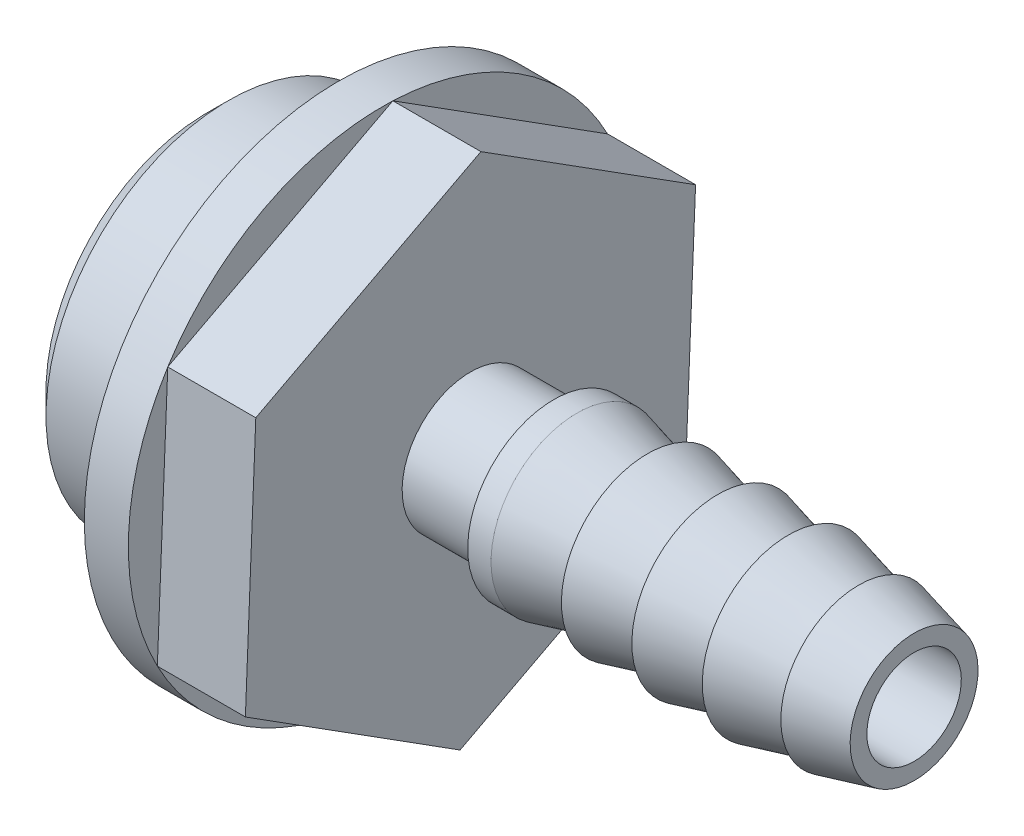
ISO-10303-21;
HEADER;
FILE_DESCRIPTION(('STEP AP214'),'2;1');
FILE_NAME('part.step','',(''),(''),'','','');
FILE_SCHEMA(('AUTOMOTIVE_DESIGN { 1 0 10303 214 1 1 1 1 }'));
ENDSEC;
DATA;
#1=APPLICATION_CONTEXT('core data for automotive mechanical design processes');
#2=APPLICATION_PROTOCOL_DEFINITION('international standard','automotive_design',2000,#1);
#3=PRODUCT_CONTEXT('',#1,'mechanical');
#4=PRODUCT('Part','Part','',(#3));
#5=PRODUCT_RELATED_PRODUCT_CATEGORY('part','',(#4));
#6=PRODUCT_DEFINITION_FORMATION('','',#4);
#7=PRODUCT_DEFINITION_CONTEXT('part definition',#1,'design');
#8=PRODUCT_DEFINITION('design','',#6,#7);
#9=PRODUCT_DEFINITION_SHAPE('','',#8);
#10=(LENGTH_UNIT() NAMED_UNIT(*) SI_UNIT(.MILLI.,.METRE.));
#11=(NAMED_UNIT(*) PLANE_ANGLE_UNIT() SI_UNIT($,.RADIAN.));
#12=(NAMED_UNIT(*) SI_UNIT($,.STERADIAN.) SOLID_ANGLE_UNIT());
#13=UNCERTAINTY_MEASURE_WITH_UNIT(LENGTH_MEASURE(1.E-05),#10,'distance_accuracy_value','');
#14=(GEOMETRIC_REPRESENTATION_CONTEXT(3) GLOBAL_UNCERTAINTY_ASSIGNED_CONTEXT((#13)) GLOBAL_UNIT_ASSIGNED_CONTEXT((#10,
#11,#12)) REPRESENTATION_CONTEXT('',''));
#15=CARTESIAN_POINT('',(0.,0.,0.));
#16=DIRECTION('',(0.,0.,1.));
#17=DIRECTION('',(1.,0.,0.));
#18=AXIS2_PLACEMENT_3D('',#15,#16,#17);
#19=CARTESIAN_POINT('',(-4.7625,0.,0.));
#20=DIRECTION('',(-1.,0.,0.));
#21=DIRECTION('',(0.,0.,1.));
#22=AXIS2_PLACEMENT_3D('',#19,#20,#21);
#23=PLANE('',#22);
#24=CARTESIAN_POINT('',(-4.7625,0.,0.));
#25=DIRECTION('',(-1.,0.,0.));
#26=DIRECTION('',(0.,0.,1.));
#27=AXIS2_PLACEMENT_3D('',#24,#25,#26);
#28=CIRCLE('',#27,9.16543552338531);
#29=CARTESIAN_POINT('',(-4.7625,0.,9.16543552338531));
#30=VERTEX_POINT('',#29);
#31=EDGE_CURVE('E149',#30,#30,#28,.T.);
#32=ORIENTED_EDGE('',*,*,#31,.T.);
#33=EDGE_LOOP('',(#32));
#34=FACE_BOUND('',#33,.T.);
#35=CARTESIAN_POINT('',(-4.7625,0.,0.));
#36=DIRECTION('',(-1.,0.,0.));
#37=DIRECTION('',(0.,0.,1.));
#38=AXIS2_PLACEMENT_3D('',#35,#36,#37);
#39=CIRCLE('',#38,6.5786);
#40=CARTESIAN_POINT('',(-4.7625,0.,-6.5786));
#41=VERTEX_POINT('',#40);
#42=EDGE_CURVE('E155',#41,#41,#39,.T.);
#43=ORIENTED_EDGE('',*,*,#42,.F.);
#44=EDGE_LOOP('',(#43));
#45=FACE_BOUND('',#44,.T.);
#46=ADVANCED_FACE('F48',(#34,#45),#23,.T.);
#47=CARTESIAN_POINT('',(0.,0.,0.));
#48=DIRECTION('',(-1.,0.,0.));
#49=DIRECTION('',(0.,-1.,0.));
#50=AXIS2_PLACEMENT_3D('',#47,#48,#49);
#51=CYLINDRICAL_SURFACE('',#50,1.70299999999999);
#52=CARTESIAN_POINT('',(-1.00000000000001,0.,0.));
#53=DIRECTION('',(1.,0.,0.));
#54=DIRECTION('',(0.,1.,0.));
#55=AXIS2_PLACEMENT_3D('',#52,#53,#54);
#56=CIRCLE('',#55,1.70299999999999);
#57=CARTESIAN_POINT('',(-1.00000000000001,1.70299999999999,0.));
#58=VERTEX_POINT('',#57);
#59=EDGE_CURVE('E57',#58,#58,#56,.F.);
#60=ORIENTED_EDGE('',*,*,#59,.T.);
#61=EDGE_LOOP('',(#60));
#62=FACE_BOUND('',#61,.T.);
#63=CARTESIAN_POINT('',(16.,0.,0.));
#64=DIRECTION('',(-1.,0.,0.));
#65=DIRECTION('',(0.,-1.,0.));
#66=AXIS2_PLACEMENT_3D('',#63,#64,#65);
#67=CIRCLE('',#66,1.70299999999999);
#68=CARTESIAN_POINT('',(16.,-1.70299999999999,0.));
#69=VERTEX_POINT('',#68);
#70=EDGE_CURVE('E583',#69,#69,#67,.T.);
#71=ORIENTED_EDGE('',*,*,#70,.F.);
#72=EDGE_LOOP('',(#71));
#73=FACE_BOUND('',#72,.T.);
#74=ADVANCED_FACE('F193',(#62,#73),#51,.F.);
#75=CARTESIAN_POINT('',(16.,1.703,0.));
#76=DIRECTION('',(-1.,0.,0.));
#77=DIRECTION('',(0.,-1.,0.));
#78=AXIS2_PLACEMENT_3D('',#75,#76,#77);
#79=PLANE('',#78);
#80=CARTESIAN_POINT('',(16.,0.,0.));
#81=DIRECTION('',(-1.,0.,0.));
#82=DIRECTION('',(0.,-1.,0.));
#83=AXIS2_PLACEMENT_3D('',#80,#81,#82);
#84=CIRCLE('',#83,2.30625);
#85=CARTESIAN_POINT('',(16.,-2.30624999999999,0.));
#86=VERTEX_POINT('',#85);
#87=EDGE_CURVE('E182',#86,#86,#84,.F.);
#88=ORIENTED_EDGE('',*,*,#87,.T.);
#89=EDGE_LOOP('',(#88));
#90=FACE_BOUND('',#89,.T.);
#91=ORIENTED_EDGE('',*,*,#70,.T.);
#92=EDGE_LOOP('',(#91));
#93=FACE_BOUND('',#92,.T.);
#94=ADVANCED_FACE('F211',(#90,#93),#79,.F.);
#95=CARTESIAN_POINT('',(14.,3.1,0.));
#96=DIRECTION('',(1.,0.,0.));
#97=DIRECTION('',(0.,1.,0.));
#98=AXIS2_PLACEMENT_3D('',#95,#96,#97);
#99=PLANE('',#98);
#100=CARTESIAN_POINT('',(14.,0.,0.));
#101=DIRECTION('',(1.,0.,0.));
#102=DIRECTION('',(0.,1.,0.));
#103=AXIS2_PLACEMENT_3D('',#100,#101,#102);
#104=CIRCLE('',#103,2.80625);
#105=CARTESIAN_POINT('',(14.,2.80625,0.));
#106=VERTEX_POINT('',#105);
#107=EDGE_CURVE('E187',#106,#106,#104,.F.);
#108=ORIENTED_EDGE('',*,*,#107,.T.);
#109=EDGE_LOOP('',(#108));
#110=FACE_BOUND('',#109,.T.);
#111=CARTESIAN_POINT('',(14.,0.,0.));
#112=DIRECTION('',(-1.,0.,0.));
#113=DIRECTION('',(0.,-1.,0.));
#114=AXIS2_PLACEMENT_3D('',#111,#112,#113);
#115=CIRCLE('',#114,2.46499999999999);
#116=CARTESIAN_POINT('',(14.,-2.46499999999999,0.));
#117=VERTEX_POINT('',#116);
#118=EDGE_CURVE('E580',#117,#117,#115,.T.);
#119=ORIENTED_EDGE('',*,*,#118,.F.);
#120=EDGE_LOOP('',(#119));
#121=FACE_BOUND('',#120,.T.);
#122=ADVANCED_FACE('F286',(#110,#121),#99,.F.);
#123=CARTESIAN_POINT('',(14.,0.,0.));
#124=DIRECTION('',(-1.,0.,0.));
#125=DIRECTION('',(0.,-1.,0.));
#126=AXIS2_PLACEMENT_3D('',#123,#124,#125);
#127=CONICAL_SURFACE('',#126,2.46499999999999,0.244978663126865);
#128=CARTESIAN_POINT('',(11.46,0.,0.));
#129=DIRECTION('',(-1.,0.,0.));
#130=DIRECTION('',(0.,-1.,0.));
#131=AXIS2_PLACEMENT_3D('',#128,#129,#130);
#132=CIRCLE('',#131,3.1);
#133=CARTESIAN_POINT('',(11.46,-3.09999999999999,0.));
#134=VERTEX_POINT('',#133);
#135=EDGE_CURVE('E577',#134,#134,#132,.T.);
#136=ORIENTED_EDGE('',*,*,#135,.F.);
#137=EDGE_LOOP('',(#136));
#138=FACE_BOUND('',#137,.T.);
#139=ORIENTED_EDGE('',*,*,#118,.T.);
#140=EDGE_LOOP('',(#139));
#141=FACE_BOUND('',#140,.T.);
#142=ADVANCED_FACE('F282',(#138,#141),#127,.T.);
#143=CARTESIAN_POINT('',(11.46,3.1,0.));
#144=DIRECTION('',(1.,0.,0.));
#145=DIRECTION('',(0.,1.,0.));
#146=AXIS2_PLACEMENT_3D('',#143,#144,#145);
#147=PLANE('',#146);
#148=CARTESIAN_POINT('',(11.46,0.,0.));
#149=DIRECTION('',(-1.,0.,0.));
#150=DIRECTION('',(0.,-1.,0.));
#151=AXIS2_PLACEMENT_3D('',#148,#149,#150);
#152=CIRCLE('',#151,2.465);
#153=CARTESIAN_POINT('',(11.46,-2.46499999999999,0.));
#154=VERTEX_POINT('',#153);
#155=EDGE_CURVE('E574',#154,#154,#152,.T.);
#156=ORIENTED_EDGE('',*,*,#155,.F.);
#157=EDGE_LOOP('',(#156));
#158=FACE_BOUND('',#157,.T.);
#159=ORIENTED_EDGE('',*,*,#135,.T.);
#160=EDGE_LOOP('',(#159));
#161=FACE_BOUND('',#160,.T.);
#162=ADVANCED_FACE('F278',(#158,#161),#147,.F.);
#163=CARTESIAN_POINT('',(11.46,0.,0.));
#164=DIRECTION('',(-1.,0.,0.));
#165=DIRECTION('',(0.,-1.,0.));
#166=AXIS2_PLACEMENT_3D('',#163,#164,#165);
#167=CONICAL_SURFACE('',#166,2.465,0.244978663126865);
#168=CARTESIAN_POINT('',(8.92,0.,0.));
#169=DIRECTION('',(-1.,0.,0.));
#170=DIRECTION('',(0.,-1.,0.));
#171=AXIS2_PLACEMENT_3D('',#168,#169,#170);
#172=CIRCLE('',#171,3.1);
#173=CARTESIAN_POINT('',(8.92,-3.09999999999999,0.));
#174=VERTEX_POINT('',#173);
#175=EDGE_CURVE('E571',#174,#174,#172,.T.);
#176=ORIENTED_EDGE('',*,*,#175,.F.);
#177=EDGE_LOOP('',(#176));
#178=FACE_BOUND('',#177,.T.);
#179=ORIENTED_EDGE('',*,*,#155,.T.);
#180=EDGE_LOOP('',(#179));
#181=FACE_BOUND('',#180,.T.);
#182=ADVANCED_FACE('F274',(#178,#181),#167,.T.);
#183=CARTESIAN_POINT('',(8.92,3.1,0.));
#184=DIRECTION('',(1.,0.,0.));
#185=DIRECTION('',(0.,1.,0.));
#186=AXIS2_PLACEMENT_3D('',#183,#184,#185);
#187=PLANE('',#186);
#188=CARTESIAN_POINT('',(8.92,0.,0.));
#189=DIRECTION('',(-1.,0.,0.));
#190=DIRECTION('',(0.,-1.,0.));
#191=AXIS2_PLACEMENT_3D('',#188,#189,#190);
#192=CIRCLE('',#191,2.465);
#193=CARTESIAN_POINT('',(8.92,-2.46499999999999,0.));
#194=VERTEX_POINT('',#193);
#195=EDGE_CURVE('E568',#194,#194,#192,.T.);
#196=ORIENTED_EDGE('',*,*,#195,.F.);
#197=EDGE_LOOP('',(#196));
#198=FACE_BOUND('',#197,.T.);
#199=ORIENTED_EDGE('',*,*,#175,.T.);
#200=EDGE_LOOP('',(#199));
#201=FACE_BOUND('',#200,.T.);
#202=ADVANCED_FACE('F270',(#198,#201),#187,.F.);
#203=CARTESIAN_POINT('',(8.92,0.,0.));
#204=DIRECTION('',(-1.,0.,0.));
#205=DIRECTION('',(0.,-1.,0.));
#206=AXIS2_PLACEMENT_3D('',#203,#204,#205);
#207=CONICAL_SURFACE('',#206,2.465,0.244978663126864);
#208=CARTESIAN_POINT('',(6.38,0.,0.));
#209=DIRECTION('',(-1.,0.,0.));
#210=DIRECTION('',(0.,-1.,0.));
#211=AXIS2_PLACEMENT_3D('',#208,#209,#210);
#212=CIRCLE('',#211,3.1);
#213=CARTESIAN_POINT('',(6.38,-3.1,0.));
#214=VERTEX_POINT('',#213);
#215=EDGE_CURVE('E565',#214,#214,#212,.T.);
#216=ORIENTED_EDGE('',*,*,#215,.F.);
#217=EDGE_LOOP('',(#216));
#218=FACE_BOUND('',#217,.T.);
#219=ORIENTED_EDGE('',*,*,#195,.T.);
#220=EDGE_LOOP('',(#219));
#221=FACE_BOUND('',#220,.T.);
#222=ADVANCED_FACE('F266',(#218,#221),#207,.T.);
#223=CARTESIAN_POINT('',(6.38,3.1,0.));
#224=DIRECTION('',(1.,0.,0.));
#225=DIRECTION('',(0.,1.,0.));
#226=AXIS2_PLACEMENT_3D('',#223,#224,#225);
#227=PLANE('',#226);
#228=CARTESIAN_POINT('',(6.38,0.,0.));
#229=DIRECTION('',(-1.,0.,0.));
#230=DIRECTION('',(0.,-1.,0.));
#231=AXIS2_PLACEMENT_3D('',#228,#229,#230);
#232=CIRCLE('',#231,2.465);
#233=CARTESIAN_POINT('',(6.38,-2.46499999999999,0.));
#234=VERTEX_POINT('',#233);
#235=EDGE_CURVE('E562',#234,#234,#232,.T.);
#236=ORIENTED_EDGE('',*,*,#235,.F.);
#237=EDGE_LOOP('',(#236));
#238=FACE_BOUND('',#237,.T.);
#239=ORIENTED_EDGE('',*,*,#215,.T.);
#240=EDGE_LOOP('',(#239));
#241=FACE_BOUND('',#240,.T.);
#242=ADVANCED_FACE('F262',(#238,#241),#227,.F.);
#243=CARTESIAN_POINT('',(6.38,0.,0.));
#244=DIRECTION('',(-1.,0.,0.));
#245=DIRECTION('',(0.,-1.,0.));
#246=AXIS2_PLACEMENT_3D('',#243,#244,#245);
#247=CONICAL_SURFACE('',#246,2.465,0.244978663126864);
#248=CARTESIAN_POINT('',(3.84,0.,0.));
#249=DIRECTION('',(-1.,0.,0.));
#250=DIRECTION('',(0.,-1.,0.));
#251=AXIS2_PLACEMENT_3D('',#248,#249,#250);
#252=CIRCLE('',#251,3.1);
#253=CARTESIAN_POINT('',(3.84,-3.1,0.));
#254=VERTEX_POINT('',#253);
#255=EDGE_CURVE('E559',#254,#254,#252,.T.);
#256=ORIENTED_EDGE('',*,*,#255,.F.);
#257=EDGE_LOOP('',(#256));
#258=FACE_BOUND('',#257,.T.);
#259=ORIENTED_EDGE('',*,*,#235,.T.);
#260=EDGE_LOOP('',(#259));
#261=FACE_BOUND('',#260,.T.);
#262=ADVANCED_FACE('F258',(#258,#261),#247,.T.);
#263=CARTESIAN_POINT('',(0.,0.,0.));
#264=DIRECTION('',(-1.,0.,0.));
#265=DIRECTION('',(0.,-1.,0.));
#266=AXIS2_PLACEMENT_3D('',#263,#264,#265);
#267=CYLINDRICAL_SURFACE('',#266,3.1);
#268=CARTESIAN_POINT('',(3.,0.,0.));
#269=DIRECTION('',(-1.,0.,0.));
#270=DIRECTION('',(0.,-1.,0.));
#271=AXIS2_PLACEMENT_3D('',#268,#269,#270);
#272=CIRCLE('',#271,3.1);
#273=CARTESIAN_POINT('',(3.,-3.1,0.));
#274=VERTEX_POINT('',#273);
#275=EDGE_CURVE('E556',#274,#274,#272,.T.);
#276=ORIENTED_EDGE('',*,*,#275,.F.);
#277=EDGE_LOOP('',(#276));
#278=FACE_BOUND('',#277,.T.);
#279=ORIENTED_EDGE('',*,*,#255,.T.);
#280=EDGE_LOOP('',(#279));
#281=FACE_BOUND('',#280,.T.);
#282=ADVANCED_FACE('F254',(#278,#281),#267,.T.);
#283=CARTESIAN_POINT('',(3.,3.1,0.));
#284=DIRECTION('',(1.,0.,0.));
#285=DIRECTION('',(0.,1.,0.));
#286=AXIS2_PLACEMENT_3D('',#283,#284,#285);
#287=PLANE('',#286);
#288=CARTESIAN_POINT('',(3.,0.,0.));
#289=DIRECTION('',(-1.,0.,0.));
#290=DIRECTION('',(0.,-1.,0.));
#291=AXIS2_PLACEMENT_3D('',#288,#289,#290);
#292=CIRCLE('',#291,2.465);
#293=CARTESIAN_POINT('',(3.,-2.465,0.));
#294=VERTEX_POINT('',#293);
#295=EDGE_CURVE('E553',#294,#294,#292,.T.);
#296=ORIENTED_EDGE('',*,*,#295,.F.);
#297=EDGE_LOOP('',(#296));
#298=FACE_BOUND('',#297,.T.);
#299=ORIENTED_EDGE('',*,*,#275,.T.);
#300=EDGE_LOOP('',(#299));
#301=FACE_BOUND('',#300,.T.);
#302=ADVANCED_FACE('F250',(#298,#301),#287,.F.);
#303=CARTESIAN_POINT('',(0.,0.,0.));
#304=DIRECTION('',(-1.,0.,0.));
#305=DIRECTION('',(0.,-1.,0.));
#306=AXIS2_PLACEMENT_3D('',#303,#304,#305);
#307=CYLINDRICAL_SURFACE('',#306,2.465);
#308=CARTESIAN_POINT('',(0.,0.,0.));
#309=DIRECTION('',(-1.,0.,0.));
#310=DIRECTION('',(0.,-1.,0.));
#311=AXIS2_PLACEMENT_3D('',#308,#309,#310);
#312=CIRCLE('',#311,2.465);
#313=CARTESIAN_POINT('',(0.,-2.465,0.));
#314=VERTEX_POINT('',#313);
#315=EDGE_CURVE('E550',#314,#314,#312,.T.);
#316=ORIENTED_EDGE('',*,*,#315,.F.);
#317=EDGE_LOOP('',(#316));
#318=FACE_BOUND('',#317,.T.);
#319=ORIENTED_EDGE('',*,*,#295,.T.);
#320=EDGE_LOOP('',(#319));
#321=FACE_BOUND('',#320,.T.);
#322=ADVANCED_FACE('F247',(#318,#321),#307,.T.);
#323=CARTESIAN_POINT('',(12.825,0.,0.));
#324=DIRECTION('',(-1.,0.,0.));
#325=DIRECTION('',(0.,-1.,0.));
#326=AXIS2_PLACEMENT_3D('',#323,#324,#325);
#327=CONICAL_SURFACE('',#326,3.1,0.244978663126864);
#328=ORIENTED_EDGE('',*,*,#87,.F.);
#329=EDGE_LOOP('',(#328));
#330=FACE_BOUND('',#329,.T.);
#331=ORIENTED_EDGE('',*,*,#107,.F.);
#332=EDGE_LOOP('',(#331));
#333=FACE_BOUND('',#332,.T.);
#334=ADVANCED_FACE('F234',(#330,#333),#327,.T.);
#335=CARTESIAN_POINT('',(-3.175,-9.15772486519983,0.375877143005609));
#336=DIRECTION('',(0.,0.885801981250048,0.464063411629799));
#337=DIRECTION('',(0.,-0.464063411629799,0.885801981250049));
#338=AXIS2_PLACEMENT_3D('',#335,#336,#337);
#339=PLANE('',#338);
#340=DIRECTION('',(0.,-0.464063411629799,0.885801981250048));
#341=VECTOR('',#340,1.);
#342=CARTESIAN_POINT('',(0.,-9.15772486519983,0.375877143005609));
#343=LINE('',#342,#341);
#344=CARTESIAN_POINT('',(0.,-4.90438158714469,-7.74288380262867));
#345=VERTEX_POINT('',#344);
#346=CARTESIAN_POINT('',(0.,-9.15772486519983,0.375877143005609));
#347=VERTEX_POINT('',#346);
#348=EDGE_CURVE('E93',#345,#347,#343,.T.);
#349=ORIENTED_EDGE('',*,*,#348,.T.);
#350=DIRECTION('',(1.,0.,0.));
#351=VECTOR('',#350,1.);
#352=CARTESIAN_POINT('',(-3.175,-9.15772486519983,0.375877143005609));
#353=LINE('',#352,#351);
#354=CARTESIAN_POINT('',(-3.175,-9.15772486519983,0.375877143005607));
#355=VERTEX_POINT('',#354);
#356=EDGE_CURVE('E531',#355,#347,#353,.T.);
#357=ORIENTED_EDGE('',*,*,#356,.F.);
#358=DIRECTION('',(0.,-0.464063411629799,0.885801981250048));
#359=VECTOR('',#358,1.);
#360=CARTESIAN_POINT('',(-3.175,-9.15772486519983,0.375877143005609));
#361=LINE('',#360,#359);
#362=CARTESIAN_POINT('',(-3.175,-4.90438158714469,-7.74288380262867));
#363=VERTEX_POINT('',#362);
#364=EDGE_CURVE('E527',#363,#355,#361,.T.);
#365=ORIENTED_EDGE('',*,*,#364,.F.);
#366=DIRECTION('',(1.,0.,0.));
#367=VECTOR('',#366,1.);
#368=CARTESIAN_POINT('',(-3.175,-4.90438158714469,-7.74288380262867));
#369=LINE('',#368,#367);
#370=EDGE_CURVE('E65',#363,#345,#369,.T.);
#371=ORIENTED_EDGE('',*,*,#370,.T.);
#372=EDGE_LOOP('',(#349,#357,#365,#371));
#373=FACE_BOUND('',#372,.T.);
#374=ADVANCED_FACE('F230',(#373),#339,.F.);
#375=CARTESIAN_POINT('',(-3.175,-4.90438158714469,-7.74288380262867));
#376=DIRECTION('',(0.,0.0410102871867436,0.999158724300029));
#377=DIRECTION('',(0.,-0.999158724300029,0.0410102871867436));
#378=AXIS2_PLACEMENT_3D('',#375,#376,#377);
#379=PLANE('',#378);
#380=DIRECTION('',(0.,-0.999158724300029,0.0410102871867436));
#381=VECTOR('',#380,1.);
#382=CARTESIAN_POINT('',(0.,-4.90438158714469,-7.74288380262867));
#383=LINE('',#382,#381);
#384=CARTESIAN_POINT('',(0.,4.25334327805514,-8.11876094563429));
#385=VERTEX_POINT('',#384);
#386=EDGE_CURVE('E87',#385,#345,#383,.T.);
#387=ORIENTED_EDGE('',*,*,#386,.T.);
#388=ORIENTED_EDGE('',*,*,#370,.F.);
#389=DIRECTION('',(0.,-0.999158724300029,0.0410102871867436));
#390=VECTOR('',#389,1.);
#391=CARTESIAN_POINT('',(-3.175,-4.90438158714469,-7.74288380262867));
#392=LINE('',#391,#390);
#393=CARTESIAN_POINT('',(-3.175,4.25334327805514,-8.11876094563429));
#394=VERTEX_POINT('',#393);
#395=EDGE_CURVE('E129',#394,#363,#392,.T.);
#396=ORIENTED_EDGE('',*,*,#395,.F.);
#397=DIRECTION('',(1.,0.,0.));
#398=VECTOR('',#397,1.);
#399=CARTESIAN_POINT('',(-3.175,4.25334327805514,-8.11876094563429));
#400=LINE('',#399,#398);
#401=EDGE_CURVE('E121',#394,#385,#400,.T.);
#402=ORIENTED_EDGE('',*,*,#401,.T.);
#403=EDGE_LOOP('',(#387,#388,#396,#402));
#404=FACE_BOUND('',#403,.T.);
#405=ADVANCED_FACE('F233',(#404),#379,.F.);
#406=CARTESIAN_POINT('',(-3.175,4.25334327805514,-8.11876094563429));
#407=DIRECTION('',(0.,-0.844791694063305,0.53509531267023));
#408=DIRECTION('',(0.,-0.53509531267023,-0.844791694063305));
#409=AXIS2_PLACEMENT_3D('',#406,#407,#408);
#410=PLANE('',#409);
#411=DIRECTION('',(0.,-0.53509531267023,-0.844791694063305));
#412=VECTOR('',#411,1.);
#413=CARTESIAN_POINT('',(0.,4.25334327805514,-8.11876094563429));
#414=LINE('',#413,#412);
#415=CARTESIAN_POINT('',(0.,9.15772486519983,-0.375877143005614));
#416=VERTEX_POINT('',#415);
#417=EDGE_CURVE('E539',#416,#385,#414,.T.);
#418=ORIENTED_EDGE('',*,*,#417,.T.);
#419=ORIENTED_EDGE('',*,*,#401,.F.);
#420=DIRECTION('',(0.,-0.53509531267023,-0.844791694063305));
#421=VECTOR('',#420,1.);
#422=CARTESIAN_POINT('',(-3.175,4.25334327805514,-8.11876094563429));
#423=LINE('',#422,#421);
#424=CARTESIAN_POINT('',(-3.175,9.15772486519983,-0.375877143005614));
#425=VERTEX_POINT('',#424);
#426=EDGE_CURVE('E124',#425,#394,#423,.T.);
#427=ORIENTED_EDGE('',*,*,#426,.F.);
#428=DIRECTION('',(1.,0.,0.));
#429=VECTOR('',#428,1.);
#430=CARTESIAN_POINT('',(-3.175,9.15772486519983,-0.375877143005614));
#431=LINE('',#430,#429);
#432=EDGE_CURVE('E110',#425,#416,#431,.T.);
#433=ORIENTED_EDGE('',*,*,#432,.T.);
#434=EDGE_LOOP('',(#418,#419,#427,#433));
#435=FACE_BOUND('',#434,.T.);
#436=ADVANCED_FACE('F125',(#435),#410,.F.);
#437=CARTESIAN_POINT('',(-3.175,9.15772486519983,-0.375877143005614));
#438=DIRECTION('',(0.,-0.885801981250049,-0.464063411629799));
#439=DIRECTION('',(0.,0.464063411629799,-0.885801981250049));
#440=AXIS2_PLACEMENT_3D('',#437,#438,#439);
#441=PLANE('',#440);
#442=DIRECTION('',(0.,0.464063411629799,-0.885801981250049));
#443=VECTOR('',#442,1.);
#444=CARTESIAN_POINT('',(0.,9.15772486519983,-0.375877143005614));
#445=LINE('',#444,#443);
#446=CARTESIAN_POINT('',(0.,4.90438158714469,7.74288380262867));
#447=VERTEX_POINT('',#446);
#448=EDGE_CURVE('E117',#447,#416,#445,.T.);
#449=ORIENTED_EDGE('',*,*,#448,.T.);
#450=ORIENTED_EDGE('',*,*,#432,.F.);
#451=DIRECTION('',(0.,0.464063411629799,-0.885801981250049));
#452=VECTOR('',#451,1.);
#453=CARTESIAN_POINT('',(-3.175,9.15772486519983,-0.375877143005614));
#454=LINE('',#453,#452);
#455=CARTESIAN_POINT('',(-3.175,4.90438158714469,7.74288380262867));
#456=VERTEX_POINT('',#455);
#457=EDGE_CURVE('E115',#456,#425,#454,.T.);
#458=ORIENTED_EDGE('',*,*,#457,.F.);
#459=DIRECTION('',(1.,0.,0.));
#460=VECTOR('',#459,1.);
#461=CARTESIAN_POINT('',(-3.175,4.90438158714469,7.74288380262867));
#462=LINE('',#461,#460);
#463=EDGE_CURVE('E120',#456,#447,#462,.T.);
#464=ORIENTED_EDGE('',*,*,#463,.T.);
#465=EDGE_LOOP('',(#449,#450,#458,#464));
#466=FACE_BOUND('',#465,.T.);
#467=ADVANCED_FACE('F112',(#466),#441,.F.);
#468=CARTESIAN_POINT('',(-3.175,4.90438158714469,7.74288380262867));
#469=DIRECTION('',(0.,-0.0410102871867433,-0.999158724300029));
#470=DIRECTION('',(0.,0.999158724300029,-0.0410102871867433));
#471=AXIS2_PLACEMENT_3D('',#468,#469,#470);
#472=PLANE('',#471);
#473=DIRECTION('',(0.,0.999158724300029,-0.0410102871867433));
#474=VECTOR('',#473,1.);
#475=CARTESIAN_POINT('',(0.,4.90438158714469,7.74288380262867));
#476=LINE('',#475,#474);
#477=CARTESIAN_POINT('',(0.,-4.25334327805514,8.11876094563428));
#478=VERTEX_POINT('',#477);
#479=EDGE_CURVE('E536',#478,#447,#476,.T.);
#480=ORIENTED_EDGE('',*,*,#479,.T.);
#481=ORIENTED_EDGE('',*,*,#463,.F.);
#482=DIRECTION('',(0.,0.999158724300029,-0.0410102871867433));
#483=VECTOR('',#482,1.);
#484=CARTESIAN_POINT('',(-3.175,4.90438158714469,7.74288380262867));
#485=LINE('',#484,#483);
#486=CARTESIAN_POINT('',(-3.175,-4.25334327805514,8.11876094563428));
#487=VERTEX_POINT('',#486);
#488=EDGE_CURVE('E102',#487,#456,#485,.T.);
#489=ORIENTED_EDGE('',*,*,#488,.F.);
#490=DIRECTION('',(1.,0.,0.));
#491=VECTOR('',#490,1.);
#492=CARTESIAN_POINT('',(-3.175,-4.25334327805514,8.11876094563428));
#493=LINE('',#492,#491);
#494=EDGE_CURVE('E548',#487,#478,#493,.T.);
#495=ORIENTED_EDGE('',*,*,#494,.T.);
#496=EDGE_LOOP('',(#480,#481,#489,#495));
#497=FACE_BOUND('',#496,.T.);
#498=ADVANCED_FACE('F241',(#497),#472,.F.);
#499=CARTESIAN_POINT('',(-3.175,-4.25334327805514,8.11876094563428));
#500=DIRECTION('',(0.,0.844791694063305,-0.535095312670229));
#501=DIRECTION('',(0.,0.535095312670229,0.844791694063305));
#502=AXIS2_PLACEMENT_3D('',#499,#500,#501);
#503=PLANE('',#502);
#504=DIRECTION('',(0.,0.535095312670229,0.844791694063305));
#505=VECTOR('',#504,1.);
#506=CARTESIAN_POINT('',(0.,-4.25334327805514,8.11876094563428));
#507=LINE('',#506,#505);
#508=EDGE_CURVE('E151',#347,#478,#507,.T.);
#509=ORIENTED_EDGE('',*,*,#508,.T.);
#510=ORIENTED_EDGE('',*,*,#494,.F.);
#511=DIRECTION('',(0.,0.535095312670229,0.844791694063305));
#512=VECTOR('',#511,1.);
#513=CARTESIAN_POINT('',(-3.175,-4.25334327805514,8.11876094563428));
#514=LINE('',#513,#512);
#515=EDGE_CURVE('E543',#355,#487,#514,.T.);
#516=ORIENTED_EDGE('',*,*,#515,.F.);
#517=ORIENTED_EDGE('',*,*,#356,.T.);
#518=EDGE_LOOP('',(#509,#510,#516,#517));
#519=FACE_BOUND('',#518,.T.);
#520=ADVANCED_FACE('F228',(#519),#503,.F.);
#521=CARTESIAN_POINT('',(0.,0.,0.));
#522=DIRECTION('',(1.,0.,0.));
#523=DIRECTION('',(0.,0.,-1.));
#524=AXIS2_PLACEMENT_3D('',#521,#522,#523);
#525=PLANE('',#524);
#526=ORIENTED_EDGE('',*,*,#508,.F.);
#527=ORIENTED_EDGE('',*,*,#348,.F.);
#528=ORIENTED_EDGE('',*,*,#386,.F.);
#529=ORIENTED_EDGE('',*,*,#417,.F.);
#530=ORIENTED_EDGE('',*,*,#448,.F.);
#531=ORIENTED_EDGE('',*,*,#479,.F.);
#532=EDGE_LOOP('',(#526,#527,#528,#529,#530,#531));
#533=FACE_BOUND('',#532,.T.);
#534=ORIENTED_EDGE('',*,*,#315,.T.);
#535=EDGE_LOOP('',(#534));
#536=FACE_BOUND('',#535,.T.);
#537=ADVANCED_FACE('F220',(#533,#536),#525,.T.);
#538=CARTESIAN_POINT('',(-3.175,0.,0.));
#539=DIRECTION('',(-1.,0.,0.));
#540=DIRECTION('',(0.,0.,1.));
#541=AXIS2_PLACEMENT_3D('',#538,#539,#540);
#542=PLANE('',#541);
#543=CARTESIAN_POINT('',(-3.175,0.,0.));
#544=DIRECTION('',(-1.,0.,0.));
#545=DIRECTION('',(0.,0.,1.));
#546=AXIS2_PLACEMENT_3D('',#543,#544,#545);
#547=CIRCLE('',#546,9.16543552338531);
#548=EDGE_CURVE('E154',#355,#487,#547,.T.);
#549=ORIENTED_EDGE('',*,*,#548,.F.);
#550=ORIENTED_EDGE('',*,*,#515,.T.);
#551=EDGE_LOOP('',(#549,#550));
#552=FACE_BOUND('',#551,.T.);
#553=ADVANCED_FACE('F216',(#552),#542,.F.);
#554=EDGE_CURVE('E148',#487,#456,#547,.T.);
#555=ORIENTED_EDGE('',*,*,#554,.F.);
#556=ORIENTED_EDGE('',*,*,#488,.T.);
#557=EDGE_LOOP('',(#555,#556));
#558=FACE_BOUND('',#557,.T.);
#559=ADVANCED_FACE('F219',(#558),#542,.F.);
#560=EDGE_CURVE('E135',#456,#425,#547,.T.);
#561=ORIENTED_EDGE('',*,*,#560,.F.);
#562=ORIENTED_EDGE('',*,*,#457,.T.);
#563=EDGE_LOOP('',(#561,#562));
#564=FACE_BOUND('',#563,.T.);
#565=ADVANCED_FACE('F133',(#564),#542,.F.);
#566=EDGE_CURVE('E138',#425,#394,#547,.T.);
#567=ORIENTED_EDGE('',*,*,#566,.F.);
#568=ORIENTED_EDGE('',*,*,#426,.T.);
#569=EDGE_LOOP('',(#567,#568));
#570=FACE_BOUND('',#569,.T.);
#571=ADVANCED_FACE('F139',(#570),#542,.F.);
#572=EDGE_CURVE('E142',#394,#363,#547,.T.);
#573=ORIENTED_EDGE('',*,*,#572,.F.);
#574=ORIENTED_EDGE('',*,*,#395,.T.);
#575=EDGE_LOOP('',(#573,#574));
#576=FACE_BOUND('',#575,.T.);
#577=ADVANCED_FACE('F444',(#576),#542,.F.);
#578=EDGE_CURVE('E156',#363,#355,#547,.T.);
#579=ORIENTED_EDGE('',*,*,#578,.F.);
#580=ORIENTED_EDGE('',*,*,#364,.T.);
#581=EDGE_LOOP('',(#579,#580));
#582=FACE_BOUND('',#581,.T.);
#583=ADVANCED_FACE('F222',(#582),#542,.F.);
#584=CARTESIAN_POINT('',(-4.7625,0.,0.));
#585=DIRECTION('',(1.,0.,0.));
#586=DIRECTION('',(0.,0.,-1.));
#587=AXIS2_PLACEMENT_3D('',#584,#585,#586);
#588=CYLINDRICAL_SURFACE('',#587,9.16543552338531);
#589=ORIENTED_EDGE('',*,*,#31,.F.);
#590=EDGE_LOOP('',(#589));
#591=FACE_BOUND('',#590,.T.);
#592=ORIENTED_EDGE('',*,*,#560,.T.);
#593=ORIENTED_EDGE('',*,*,#566,.T.);
#594=ORIENTED_EDGE('',*,*,#572,.T.);
#595=ORIENTED_EDGE('',*,*,#578,.T.);
#596=ORIENTED_EDGE('',*,*,#548,.T.);
#597=ORIENTED_EDGE('',*,*,#554,.T.);
#598=EDGE_LOOP('',(#592,#593,#594,#595,#596,#597));
#599=FACE_BOUND('',#598,.T.);
#600=ADVANCED_FACE('F145',(#591,#599),#588,.T.);
#601=CARTESIAN_POINT('',(-9.525,0.,0.));
#602=DIRECTION('',(1.,0.,0.));
#603=DIRECTION('',(0.,0.,-1.));
#604=AXIS2_PLACEMENT_3D('',#601,#602,#603);
#605=CYLINDRICAL_SURFACE('',#604,6.5786);
#606=CARTESIAN_POINT('',(-8.73125000000002,0.,0.));
#607=DIRECTION('',(-1.,0.,0.));
#608=DIRECTION('',(0.,0.,1.));
#609=AXIS2_PLACEMENT_3D('',#606,#607,#608);
#610=CIRCLE('',#609,6.5786);
#611=CARTESIAN_POINT('',(-8.73125000000002,0.,-6.5786));
#612=VERTEX_POINT('',#611);
#613=EDGE_CURVE('E181',#612,#612,#610,.F.);
#614=CARTESIAN_POINT('',(-8.73125000000002,0.,-6.5786));
#615=CARTESIAN_POINT('',(-8.68990885416668,0.,-6.5786));
#616=CARTESIAN_POINT('',(-8.64856770833335,0.,-6.5786));
#617=CARTESIAN_POINT('',(-8.56588541666668,0.,-6.5786));
#618=CARTESIAN_POINT('',(-8.52454427083335,0.,-6.5786));
#619=CARTESIAN_POINT('',(-8.44186197916668,0.,-6.5786));
#620=CARTESIAN_POINT('',(-8.40052083333335,0.,-6.5786));
#621=CARTESIAN_POINT('',(-8.31783854166668,0.,-6.5786));
#622=CARTESIAN_POINT('',(-8.27649739583335,0.,-6.5786));
#623=CARTESIAN_POINT('',(-8.19381510416668,0.,-6.5786));
#624=CARTESIAN_POINT('',(-8.15247395833335,0.,-6.5786));
#625=CARTESIAN_POINT('',(-8.06979166666668,0.,-6.5786));
#626=CARTESIAN_POINT('',(-8.02845052083334,0.,-6.5786));
#627=CARTESIAN_POINT('',(-7.94576822916668,0.,-6.5786));
#628=CARTESIAN_POINT('',(-7.90442708333334,0.,-6.5786));
#629=CARTESIAN_POINT('',(-7.82174479166668,0.,-6.5786));
#630=CARTESIAN_POINT('',(-7.78040364583334,0.,-6.5786));
#631=CARTESIAN_POINT('',(-7.69772135416668,0.,-6.5786));
#632=CARTESIAN_POINT('',(-7.65638020833334,0.,-6.5786));
#633=CARTESIAN_POINT('',(-7.57369791666668,0.,-6.5786));
#634=CARTESIAN_POINT('',(-7.53235677083334,0.,-6.5786));
#635=CARTESIAN_POINT('',(-7.44967447916668,0.,-6.5786));
#636=CARTESIAN_POINT('',(-7.40833333333334,0.,-6.5786));
#637=CARTESIAN_POINT('',(-7.32565104166668,0.,-6.5786));
#638=CARTESIAN_POINT('',(-7.28430989583334,0.,-6.5786));
#639=CARTESIAN_POINT('',(-7.20162760416668,0.,-6.5786));
#640=CARTESIAN_POINT('',(-7.16028645833334,0.,-6.5786));
#641=CARTESIAN_POINT('',(-7.07760416666668,0.,-6.5786));
#642=CARTESIAN_POINT('',(-7.03626302083334,0.,-6.5786));
#643=CARTESIAN_POINT('',(-6.95358072916667,0.,-6.5786));
#644=CARTESIAN_POINT('',(-6.91223958333334,0.,-6.5786));
#645=CARTESIAN_POINT('',(-6.82955729166667,0.,-6.5786));
#646=CARTESIAN_POINT('',(-6.78821614583334,0.,-6.5786));
#647=CARTESIAN_POINT('',(-6.70553385416667,0.,-6.5786));
#648=CARTESIAN_POINT('',(-6.66419270833334,0.,-6.5786));
#649=CARTESIAN_POINT('',(-6.58151041666667,0.,-6.5786));
#650=CARTESIAN_POINT('',(-6.54016927083334,0.,-6.5786));
#651=CARTESIAN_POINT('',(-6.45748697916667,0.,-6.5786));
#652=CARTESIAN_POINT('',(-6.41614583333334,0.,-6.5786));
#653=CARTESIAN_POINT('',(-6.33346354166667,0.,-6.5786));
#654=CARTESIAN_POINT('',(-6.29212239583334,0.,-6.5786));
#655=CARTESIAN_POINT('',(-6.20944010416667,0.,-6.5786));
#656=CARTESIAN_POINT('',(-6.16809895833334,0.,-6.5786));
#657=CARTESIAN_POINT('',(-6.08541666666667,0.,-6.5786));
#658=CARTESIAN_POINT('',(-6.04407552083334,0.,-6.5786));
#659=CARTESIAN_POINT('',(-5.96139322916667,0.,-6.5786));
#660=CARTESIAN_POINT('',(-5.92005208333334,0.,-6.5786));
#661=CARTESIAN_POINT('',(-5.83736979166667,0.,-6.5786));
#662=CARTESIAN_POINT('',(-5.79602864583334,0.,-6.5786));
#663=CARTESIAN_POINT('',(-5.71334635416667,0.,-6.5786));
#664=CARTESIAN_POINT('',(-5.67200520833334,0.,-6.5786));
#665=CARTESIAN_POINT('',(-5.58932291666667,0.,-6.5786));
#666=CARTESIAN_POINT('',(-5.54798177083334,0.,-6.5786));
#667=CARTESIAN_POINT('',(-5.46529947916667,0.,-6.5786));
#668=CARTESIAN_POINT('',(-5.42395833333334,0.,-6.5786));
#669=CARTESIAN_POINT('',(-5.34127604166667,0.,-6.5786));
#670=CARTESIAN_POINT('',(-5.29993489583334,0.,-6.5786));
#671=CARTESIAN_POINT('',(-5.21725260416667,0.,-6.5786));
#672=CARTESIAN_POINT('',(-5.17591145833334,0.,-6.5786));
#673=CARTESIAN_POINT('',(-5.09322916666667,0.,-6.5786));
#674=CARTESIAN_POINT('',(-5.05188802083333,0.,-6.5786));
#675=CARTESIAN_POINT('',(-4.96920572916667,0.,-6.5786));
#676=CARTESIAN_POINT('',(-4.92786458333333,0.,-6.5786));
#677=CARTESIAN_POINT('',(-4.84518229166667,0.,-6.5786));
#678=CARTESIAN_POINT('',(-4.80384114583333,0.,-6.5786));
#679=CARTESIAN_POINT('',(-4.7625,0.,-6.5786));
#680=B_SPLINE_CURVE_WITH_KNOTS('',3,(#614,#615,#616,#617,#618,#619,#620,#621,#622,#623,#624,
#625,#626,#627,#628,#629,#630,#631,#632,#633,#634,#635,#636,#637,#638,#639,#640,#641,#642,#643,
#644,#645,#646,#647,#648,#649,#650,#651,#652,#653,#654,#655,#656,#657,#658,#659,#660,#661,#662,
#663,#664,#665,#666,#667,#668,#669,#670,#671,#672,#673,#674,#675,#676,#677,#678,#679),
.UNSPECIFIED.,.F.,.F.,(4,2,2,2,2,2,2,2,2,2,2,2,2,2,2,2,2,2,2,2,2,2,2,2,2,2,2,2,2,2,2,2,4),(0.,
0.124023437500001,0.248046875000001,0.372070312500002,0.496093750000003,0.620117187500003,
0.744140625000004,0.868164062500005,0.992187500000004,1.11621093750001,1.240234375,
1.36425781250001,1.48828125000001,1.61230468750001,1.73632812500001,1.86035156250001,
1.98437500000001,2.10839843750001,2.23242187500001,2.35644531250001,2.48046875000001,
2.60449218750001,2.72851562500001,2.85253906250001,2.97656250000001,3.10058593750001,
3.22460937500001,3.34863281250001,3.47265625000001,3.59667968750001,3.72070312500001,
3.84472656250001,3.96875000000001),.UNSPECIFIED.);
#681=EDGE_CURVE('BSEAM175',#612,#41,#680,.T.);
#682=ORIENTED_EDGE('',*,*,#613,.T.);
#683=ORIENTED_EDGE('',*,*,#42,.T.);
#684=ORIENTED_EDGE('',*,*,#681,.T.);
#685=ORIENTED_EDGE('',*,*,#681,.F.);
#686=EDGE_LOOP('',(#682,#684,#683,#685));
#687=FACE_BOUND('',#686,.T.);
#688=ADVANCED_FACE('F175',(#687),#605,.T.);
#689=CARTESIAN_POINT('',(-9.525,0.,0.));
#690=DIRECTION('',(-1.,0.,0.));
#691=DIRECTION('',(0.,0.,1.));
#692=AXIS2_PLACEMENT_3D('',#689,#690,#691);
#693=PLANE('',#692);
#694=CARTESIAN_POINT('',(-9.525,0.,0.));
#695=DIRECTION('',(-1.,0.,0.));
#696=DIRECTION('',(0.,0.,1.));
#697=AXIS2_PLACEMENT_3D('',#694,#695,#696);
#698=CIRCLE('',#697,5.);
#699=CARTESIAN_POINT('',(-9.525,0.,5.));
#700=VERTEX_POINT('',#699);
#701=EDGE_CURVE('E163',#700,#700,#698,.T.);
#702=ORIENTED_EDGE('',*,*,#701,.F.);
#703=EDGE_LOOP('',(#702));
#704=FACE_BOUND('',#703,.T.);
#705=CARTESIAN_POINT('',(-9.525,0.,0.));
#706=DIRECTION('',(-1.,0.,0.));
#707=DIRECTION('',(0.,0.,1.));
#708=AXIS2_PLACEMENT_3D('',#705,#706,#707);
#709=CIRCLE('',#708,5.78485000000001);
#710=CARTESIAN_POINT('',(-9.525,0.,-5.78485000000001));
#711=VERTEX_POINT('',#710);
#712=EDGE_CURVE('E179',#711,#711,#709,.T.);
#713=ORIENTED_EDGE('',*,*,#712,.T.);
#714=EDGE_LOOP('',(#713));
#715=FACE_BOUND('',#714,.T.);
#716=ADVANCED_FACE('F171',(#704,#715),#693,.T.);
#717=CARTESIAN_POINT('',(-9.525,0.,0.));
#718=DIRECTION('',(1.,0.,0.));
#719=DIRECTION('',(0.,0.,-1.));
#720=AXIS2_PLACEMENT_3D('',#717,#718,#719);
#721=CONICAL_SURFACE('',#720,5.78485000000001,0.785398163397451);
#722=CARTESIAN_POINT('',(-8.73125000000002,0.,-6.5786));
#723=CARTESIAN_POINT('',(-8.73951822916668,0.,-6.57033177083334));
#724=CARTESIAN_POINT('',(-8.74778645833335,0.,-6.56206354166667));
#725=CARTESIAN_POINT('',(-8.76432291666668,0.,-6.54552708333333));
#726=CARTESIAN_POINT('',(-8.77259114583335,0.,-6.53725885416667));
#727=CARTESIAN_POINT('',(-8.78912760416668,0.,-6.52072239583334));
#728=CARTESIAN_POINT('',(-8.79739583333335,0.,-6.51245416666667));
#729=CARTESIAN_POINT('',(-8.81393229166668,0.,-6.49591770833334));
#730=CARTESIAN_POINT('',(-8.82220052083334,0.,-6.48764947916667));
#731=CARTESIAN_POINT('',(-8.83873697916668,0.,-6.47111302083334));
#732=CARTESIAN_POINT('',(-8.84700520833334,0.,-6.46284479166667));
#733=CARTESIAN_POINT('',(-8.86354166666668,0.,-6.44630833333334));
#734=CARTESIAN_POINT('',(-8.87180989583334,0.,-6.43804010416667));
#735=CARTESIAN_POINT('',(-8.88834635416668,0.,-6.42150364583334));
#736=CARTESIAN_POINT('',(-8.89661458333334,0.,-6.41323541666667));
#737=CARTESIAN_POINT('',(-8.91315104166668,0.,-6.39669895833334));
#738=CARTESIAN_POINT('',(-8.92141927083334,0.,-6.38843072916667));
#739=CARTESIAN_POINT('',(-8.93795572916668,0.,-6.37189427083334));
#740=CARTESIAN_POINT('',(-8.94622395833334,0.,-6.36362604166667));
#741=CARTESIAN_POINT('',(-8.96276041666668,0.,-6.34708958333334));
#742=CARTESIAN_POINT('',(-8.97102864583334,0.,-6.33882135416667));
#743=CARTESIAN_POINT('',(-8.98756510416668,0.,-6.32228489583334));
#744=CARTESIAN_POINT('',(-8.99583333333334,0.,-6.31401666666667));
#745=CARTESIAN_POINT('',(-9.01236979166668,0.,-6.29748020833334));
#746=CARTESIAN_POINT('',(-9.02063802083334,0.,-6.28921197916667));
#747=CARTESIAN_POINT('',(-9.03717447916667,0.,-6.27267552083334));
#748=CARTESIAN_POINT('',(-9.04544270833334,0.,-6.26440729166667));
#749=CARTESIAN_POINT('',(-9.06197916666667,0.,-6.24787083333334));
#750=CARTESIAN_POINT('',(-9.07024739583334,0.,-6.23960260416667));
#751=CARTESIAN_POINT('',(-9.08678385416667,0.,-6.22306614583334));
#752=CARTESIAN_POINT('',(-9.09505208333334,0.,-6.21479791666667));
#753=CARTESIAN_POINT('',(-9.11158854166667,0.,-6.19826145833334));
#754=CARTESIAN_POINT('',(-9.11985677083334,0.,-6.18999322916667));
#755=CARTESIAN_POINT('',(-9.13639322916667,0.,-6.17345677083334));
#756=CARTESIAN_POINT('',(-9.14466145833334,0.,-6.16518854166667));
#757=CARTESIAN_POINT('',(-9.16119791666667,0.,-6.14865208333334));
#758=CARTESIAN_POINT('',(-9.16946614583334,0.,-6.14038385416667));
#759=CARTESIAN_POINT('',(-9.18600260416667,0.,-6.12384739583334));
#760=CARTESIAN_POINT('',(-9.19427083333334,0.,-6.11557916666667));
#761=CARTESIAN_POINT('',(-9.21080729166667,0.,-6.09904270833334));
#762=CARTESIAN_POINT('',(-9.21907552083334,0.,-6.09077447916667));
#763=CARTESIAN_POINT('',(-9.23561197916667,0.,-6.07423802083334));
#764=CARTESIAN_POINT('',(-9.24388020833334,0.,-6.06596979166667));
#765=CARTESIAN_POINT('',(-9.26041666666667,0.,-6.04943333333334));
#766=CARTESIAN_POINT('',(-9.26868489583334,0.,-6.04116510416667));
#767=CARTESIAN_POINT('',(-9.28522135416667,0.,-6.02462864583334));
#768=CARTESIAN_POINT('',(-9.29348958333334,0.,-6.01636041666668));
#769=CARTESIAN_POINT('',(-9.31002604166667,0.,-5.99982395833334));
#770=CARTESIAN_POINT('',(-9.31829427083334,0.,-5.99155572916668));
#771=CARTESIAN_POINT('',(-9.33483072916667,0.,-5.97501927083334));
#772=CARTESIAN_POINT('',(-9.34309895833334,0.,-5.96675104166668));
#773=CARTESIAN_POINT('',(-9.35963541666667,0.,-5.95021458333334));
#774=CARTESIAN_POINT('',(-9.36790364583334,0.,-5.94194635416668));
#775=CARTESIAN_POINT('',(-9.38444010416667,0.,-5.92540989583334));
#776=CARTESIAN_POINT('',(-9.39270833333333,0.,-5.91714166666668));
#777=CARTESIAN_POINT('',(-9.40924479166667,0.,-5.90060520833334));
#778=CARTESIAN_POINT('',(-9.41751302083333,0.,-5.89233697916668));
#779=CARTESIAN_POINT('',(-9.43404947916667,0.,-5.87580052083334));
#780=CARTESIAN_POINT('',(-9.44231770833333,0.,-5.86753229166668));
#781=CARTESIAN_POINT('',(-9.45885416666667,0.,-5.85099583333334));
#782=CARTESIAN_POINT('',(-9.46712239583333,0.,-5.84272760416668));
#783=CARTESIAN_POINT('',(-9.48365885416667,0.,-5.82619114583334));
#784=CARTESIAN_POINT('',(-9.49192708333333,0.,-5.81792291666668));
#785=CARTESIAN_POINT('',(-9.50846354166667,0.,-5.80138645833334));
#786=CARTESIAN_POINT('',(-9.51673177083333,0.,-5.79311822916668));
#787=CARTESIAN_POINT('',(-9.525,0.,-5.78485000000001));
#788=B_SPLINE_CURVE_WITH_KNOTS('',3,(#722,#723,#724,#725,#726,#727,#728,#729,#730,#731,#732,
#733,#734,#735,#736,#737,#738,#739,#740,#741,#742,#743,#744,#745,#746,#747,#748,#749,#750,#751,
#752,#753,#754,#755,#756,#757,#758,#759,#760,#761,#762,#763,#764,#765,#766,#767,#768,#769,#770,
#771,#772,#773,#774,#775,#776,#777,#778,#779,#780,#781,#782,#783,#784,#785,#786,#787),
.UNSPECIFIED.,.F.,.F.,(4,2,2,2,2,2,2,2,2,2,2,2,2,2,2,2,2,2,2,2,2,2,2,2,2,2,2,2,2,2,2,2,4),(0.,
0.0350791254729256,0.0701582509458518,0.105237376418777,0.140316501891703,0.175395627364629,
0.210474752837555,0.24555387831048,0.280633003783406,0.315712129256332,0.350791254729258,
0.385870380202183,0.420949505675109,0.456028631148035,0.491107756620961,0.526186882093886,
0.561266007566813,0.596345133039739,0.631424258512665,0.66650338398559,0.701582509458517,
0.736661634931442,0.771740760404368,0.806819885877293,0.84189901135022,0.876978136823145,
0.912057262296071,0.947136387768997,0.982215513241923,1.01729463871485,1.05237376418777,
1.0874528896607,1.12253201513363),.UNSPECIFIED.);
#789=EDGE_CURVE('BSEAM174',#612,#711,#788,.T.);
#790=ORIENTED_EDGE('',*,*,#613,.F.);
#791=ORIENTED_EDGE('',*,*,#712,.F.);
#792=ORIENTED_EDGE('',*,*,#789,.T.);
#793=ORIENTED_EDGE('',*,*,#789,.F.);
#794=EDGE_LOOP('',(#790,#792,#791,#793));
#795=FACE_BOUND('',#794,.T.);
#796=ADVANCED_FACE('F174',(#795),#721,.T.);
#797=CARTESIAN_POINT('',(-2.,0.,1.703));
#798=DIRECTION('',(1.,0.,0.));
#799=DIRECTION('',(0.,0.,-1.));
#800=AXIS2_PLACEMENT_3D('',#797,#798,#799);
#801=PLANE('',#800);
#802=CARTESIAN_POINT('',(-2.,0.,0.));
#803=DIRECTION('',(1.,0.,0.));
#804=DIRECTION('',(0.,0.,-1.));
#805=AXIS2_PLACEMENT_3D('',#802,#803,#804);
#806=CIRCLE('',#805,2.70299999999999);
#807=CARTESIAN_POINT('',(-2.,0.,-2.70299999999999));
#808=VERTEX_POINT('',#807);
#809=EDGE_CURVE('E13',#808,#808,#806,.T.);
#810=ORIENTED_EDGE('',*,*,#809,.T.);
#811=EDGE_LOOP('',(#810));
#812=FACE_BOUND('',#811,.T.);
#813=CARTESIAN_POINT('',(-2.,0.,0.));
#814=DIRECTION('',(-1.,0.,0.));
#815=DIRECTION('',(0.,0.,1.));
#816=AXIS2_PLACEMENT_3D('',#813,#814,#815);
#817=CIRCLE('',#816,5.);
#818=CARTESIAN_POINT('',(-2.,0.,5.));
#819=VERTEX_POINT('',#818);
#820=EDGE_CURVE('E158',#819,#819,#817,.T.);
#821=ORIENTED_EDGE('',*,*,#820,.T.);
#822=EDGE_LOOP('',(#821));
#823=FACE_BOUND('',#822,.T.);
#824=ADVANCED_FACE('F201',(#812,#823),#801,.F.);
#825=CARTESIAN_POINT('',(-9.525,0.,0.));
#826=DIRECTION('',(-1.,0.,0.));
#827=DIRECTION('',(0.,0.,1.));
#828=AXIS2_PLACEMENT_3D('',#825,#826,#827);
#829=CYLINDRICAL_SURFACE('',#828,5.);
#830=ORIENTED_EDGE('',*,*,#820,.F.);
#831=EDGE_LOOP('',(#830));
#832=FACE_BOUND('',#831,.T.);
#833=ORIENTED_EDGE('',*,*,#701,.T.);
#834=EDGE_LOOP('',(#833));
#835=FACE_BOUND('',#834,.T.);
#836=ADVANCED_FACE('F169',(#832,#835),#829,.F.);
#837=CARTESIAN_POINT('',(-1.00000000000001,0.,0.));
#838=DIRECTION('',(-1.,0.,0.));
#839=DIRECTION('',(0.,-1.,0.));
#840=AXIS2_PLACEMENT_3D('',#837,#838,#839);
#841=CONICAL_SURFACE('',#840,1.70299999999999,0.785398163397451);
#842=ORIENTED_EDGE('',*,*,#809,.F.);
#843=EDGE_LOOP('',(#842));
#844=FACE_BOUND('',#843,.T.);
#845=ORIENTED_EDGE('',*,*,#59,.F.);
#846=EDGE_LOOP('',(#845));
#847=FACE_BOUND('',#846,.T.);
#848=ADVANCED_FACE('F50',(#844,#847),#841,.F.);
#849=CLOSED_SHELL('',(#46,#74,#94,#122,#142,#162,#182,#202,#222,#242,#262,#282,#302,#322,#334,
#374,#405,#436,#467,#498,#520,#537,#553,#559,#565,#571,#577,#583,#600,#688,#716,#796,#824,#836,#848));
#850=MANIFOLD_SOLID_BREP('B2',#849);
#851=ADVANCED_BREP_SHAPE_REPRESENTATION('',(#18,#850),#14);
#852=SHAPE_DEFINITION_REPRESENTATION(#9,#851);
ENDSEC;
END-ISO-10303-21;
